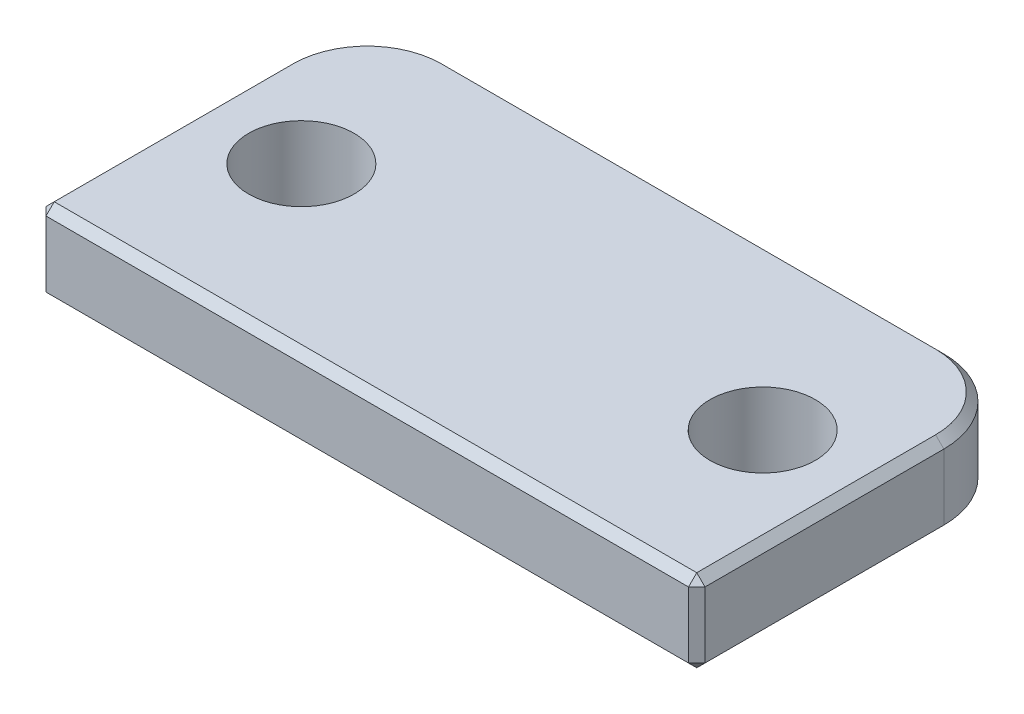
ISO-10303-21;
HEADER;
FILE_DESCRIPTION(('STEP AP214'),'2;1');
FILE_NAME('part.step','',(''),(''),'','','');
FILE_SCHEMA(('AUTOMOTIVE_DESIGN { 1 0 10303 214 1 1 1 1 }'));
ENDSEC;
DATA;
#1=APPLICATION_CONTEXT('core data for automotive mechanical design processes');
#2=APPLICATION_PROTOCOL_DEFINITION('international standard','automotive_design',2000,#1);
#3=PRODUCT_CONTEXT('',#1,'mechanical');
#4=PRODUCT('Part','Part','',(#3));
#5=PRODUCT_RELATED_PRODUCT_CATEGORY('part','',(#4));
#6=PRODUCT_DEFINITION_FORMATION('','',#4);
#7=PRODUCT_DEFINITION_CONTEXT('part definition',#1,'design');
#8=PRODUCT_DEFINITION('design','',#6,#7);
#9=PRODUCT_DEFINITION_SHAPE('','',#8);
#10=(LENGTH_UNIT() NAMED_UNIT(*) SI_UNIT(.MILLI.,.METRE.));
#11=(NAMED_UNIT(*) PLANE_ANGLE_UNIT() SI_UNIT($,.RADIAN.));
#12=(NAMED_UNIT(*) SI_UNIT($,.STERADIAN.) SOLID_ANGLE_UNIT());
#13=UNCERTAINTY_MEASURE_WITH_UNIT(LENGTH_MEASURE(1.E-05),#10,'distance_accuracy_value','');
#14=(GEOMETRIC_REPRESENTATION_CONTEXT(3) GLOBAL_UNCERTAINTY_ASSIGNED_CONTEXT((#13)) GLOBAL_UNIT_ASSIGNED_CONTEXT((#10,
#11,#12)) REPRESENTATION_CONTEXT('',''));
#15=CARTESIAN_POINT('',(0.,0.,0.));
#16=DIRECTION('',(0.,0.,1.));
#17=DIRECTION('',(1.,0.,0.));
#18=AXIS2_PLACEMENT_3D('',#15,#16,#17);
#19=CARTESIAN_POINT('',(20.,5.,10.));
#20=DIRECTION('',(-1.,0.,0.));
#21=DIRECTION('',(0.,0.,1.));
#22=AXIS2_PLACEMENT_3D('',#19,#20,#21);
#23=PLANE('',#22);
#24=DIRECTION('',(0.,-1.,0.));
#25=VECTOR('',#24,1.);
#26=CARTESIAN_POINT('',(20.,5.,9.5));
#27=LINE('',#26,#25);
#28=CARTESIAN_POINT('',(20.,4.5,9.5));
#29=VERTEX_POINT('',#28);
#30=CARTESIAN_POINT('',(20.,0.5,9.5));
#31=VERTEX_POINT('',#30);
#32=EDGE_CURVE('E53',#29,#31,#27,.T.);
#33=ORIENTED_EDGE('',*,*,#32,.T.);
#34=DIRECTION('',(0.,0.,-1.));
#35=VECTOR('',#34,1.);
#36=CARTESIAN_POINT('',(20.,0.5,-5.));
#37=LINE('',#36,#35);
#38=CARTESIAN_POINT('',(20.,0.5,-5.));
#39=VERTEX_POINT('',#38);
#40=EDGE_CURVE('E11',#31,#39,#37,.T.);
#41=ORIENTED_EDGE('',*,*,#40,.T.);
#42=DIRECTION('',(0.,-1.,0.));
#43=VECTOR('',#42,1.);
#44=CARTESIAN_POINT('',(20.,5.,-5.));
#45=LINE('',#44,#43);
#46=CARTESIAN_POINT('',(20.,4.5,-5.));
#47=VERTEX_POINT('',#46);
#48=EDGE_CURVE('E183',#39,#47,#45,.F.);
#49=ORIENTED_EDGE('',*,*,#48,.T.);
#50=DIRECTION('',(0.,0.,1.));
#51=VECTOR('',#50,1.);
#52=CARTESIAN_POINT('',(20.,4.5,10.));
#53=LINE('',#52,#51);
#54=EDGE_CURVE('E64',#47,#29,#53,.T.);
#55=ORIENTED_EDGE('',*,*,#54,.T.);
#56=EDGE_LOOP('',(#33,#41,#49,#55));
#57=FACE_BOUND('',#56,.T.);
#58=ADVANCED_FACE('F43',(#57),#23,.F.);
#59=CARTESIAN_POINT('',(-20.,5.,-10.));
#60=DIRECTION('',(0.,0.,1.));
#61=DIRECTION('',(1.,0.,0.));
#62=AXIS2_PLACEMENT_3D('',#59,#60,#61);
#63=PLANE('',#62);
#64=DIRECTION('',(0.,-1.,0.));
#65=VECTOR('',#64,1.);
#66=CARTESIAN_POINT('',(15.,5.,-10.));
#67=LINE('',#66,#65);
#68=CARTESIAN_POINT('',(15.,4.5,-10.));
#69=VERTEX_POINT('',#68);
#70=CARTESIAN_POINT('',(15.,0.5,-10.));
#71=VERTEX_POINT('',#70);
#72=EDGE_CURVE('E176',#69,#71,#67,.T.);
#73=ORIENTED_EDGE('',*,*,#72,.T.);
#74=DIRECTION('',(-1.,0.,0.));
#75=VECTOR('',#74,1.);
#76=CARTESIAN_POINT('',(-15.,0.5,-10.));
#77=LINE('',#76,#75);
#78=CARTESIAN_POINT('',(-15.,0.5,-10.));
#79=VERTEX_POINT('',#78);
#80=EDGE_CURVE('E150',#71,#79,#77,.T.);
#81=ORIENTED_EDGE('',*,*,#80,.T.);
#82=DIRECTION('',(0.,-1.,0.));
#83=VECTOR('',#82,1.);
#84=CARTESIAN_POINT('',(-15.,5.,-10.));
#85=LINE('',#84,#83);
#86=CARTESIAN_POINT('',(-15.,4.5,-10.));
#87=VERTEX_POINT('',#86);
#88=EDGE_CURVE('E173',#79,#87,#85,.F.);
#89=ORIENTED_EDGE('',*,*,#88,.T.);
#90=DIRECTION('',(1.,0.,0.));
#91=VECTOR('',#90,1.);
#92=CARTESIAN_POINT('',(-20.,4.5,-10.));
#93=LINE('',#92,#91);
#94=EDGE_CURVE('E179',#87,#69,#93,.T.);
#95=ORIENTED_EDGE('',*,*,#94,.T.);
#96=EDGE_LOOP('',(#73,#81,#89,#95));
#97=FACE_BOUND('',#96,.T.);
#98=ADVANCED_FACE('F172',(#97),#63,.F.);
#99=CARTESIAN_POINT('',(-20.,5.,10.));
#100=DIRECTION('',(1.,0.,0.));
#101=DIRECTION('',(0.,0.,-1.));
#102=AXIS2_PLACEMENT_3D('',#99,#100,#101);
#103=PLANE('',#102);
#104=DIRECTION('',(0.,1.,0.));
#105=VECTOR('',#104,1.);
#106=CARTESIAN_POINT('',(-20.,5.,9.5));
#107=LINE('',#106,#105);
#108=CARTESIAN_POINT('',(-20.,0.5,9.5));
#109=VERTEX_POINT('',#108);
#110=CARTESIAN_POINT('',(-20.,4.5,9.5));
#111=VERTEX_POINT('',#110);
#112=EDGE_CURVE('E229',#109,#111,#107,.T.);
#113=ORIENTED_EDGE('',*,*,#112,.T.);
#114=DIRECTION('',(0.,0.,-1.));
#115=VECTOR('',#114,1.);
#116=CARTESIAN_POINT('',(-20.,4.5,10.));
#117=LINE('',#116,#115);
#118=CARTESIAN_POINT('',(-20.,4.5,-5.));
#119=VERTEX_POINT('',#118);
#120=EDGE_CURVE('E231',#111,#119,#117,.T.);
#121=ORIENTED_EDGE('',*,*,#120,.T.);
#122=DIRECTION('',(0.,-1.,0.));
#123=VECTOR('',#122,1.);
#124=CARTESIAN_POINT('',(-20.,5.,-5.));
#125=LINE('',#124,#123);
#126=CARTESIAN_POINT('',(-20.,0.5,-5.));
#127=VERTEX_POINT('',#126);
#128=EDGE_CURVE('E186',#119,#127,#125,.T.);
#129=ORIENTED_EDGE('',*,*,#128,.T.);
#130=DIRECTION('',(0.,0.,1.));
#131=VECTOR('',#130,1.);
#132=CARTESIAN_POINT('',(-20.,0.5,10.));
#133=LINE('',#132,#131);
#134=EDGE_CURVE('E227',#127,#109,#133,.T.);
#135=ORIENTED_EDGE('',*,*,#134,.T.);
#136=EDGE_LOOP('',(#113,#121,#129,#135));
#137=FACE_BOUND('',#136,.T.);
#138=ADVANCED_FACE('F305',(#137),#103,.F.);
#139=CARTESIAN_POINT('',(-20.,5.,10.));
#140=DIRECTION('',(0.,0.,-1.));
#141=DIRECTION('',(-1.,0.,0.));
#142=AXIS2_PLACEMENT_3D('',#139,#140,#141);
#143=PLANE('',#142);
#144=DIRECTION('',(-1.,0.,0.));
#145=VECTOR('',#144,1.);
#146=CARTESIAN_POINT('',(-20.,4.5,10.));
#147=LINE('',#146,#145);
#148=CARTESIAN_POINT('',(19.5,4.5,10.));
#149=VERTEX_POINT('',#148);
#150=CARTESIAN_POINT('',(-19.5,4.5,10.));
#151=VERTEX_POINT('',#150);
#152=EDGE_CURVE('E218',#149,#151,#147,.T.);
#153=ORIENTED_EDGE('',*,*,#152,.T.);
#154=DIRECTION('',(0.,-1.,0.));
#155=VECTOR('',#154,1.);
#156=CARTESIAN_POINT('',(-19.5,5.,10.));
#157=LINE('',#156,#155);
#158=CARTESIAN_POINT('',(-19.5,0.5,10.));
#159=VERTEX_POINT('',#158);
#160=EDGE_CURVE('E224',#151,#159,#157,.T.);
#161=ORIENTED_EDGE('',*,*,#160,.T.);
#162=DIRECTION('',(1.,0.,0.));
#163=VECTOR('',#162,1.);
#164=CARTESIAN_POINT('',(20.,0.5,10.));
#165=LINE('',#164,#163);
#166=CARTESIAN_POINT('',(19.5,0.5,10.));
#167=VERTEX_POINT('',#166);
#168=EDGE_CURVE('E222',#159,#167,#165,.T.);
#169=ORIENTED_EDGE('',*,*,#168,.T.);
#170=DIRECTION('',(0.,1.,0.));
#171=VECTOR('',#170,1.);
#172=CARTESIAN_POINT('',(19.5,5.,10.));
#173=LINE('',#172,#171);
#174=EDGE_CURVE('E220',#167,#149,#173,.T.);
#175=ORIENTED_EDGE('',*,*,#174,.T.);
#176=EDGE_LOOP('',(#153,#161,#169,#175));
#177=FACE_BOUND('',#176,.T.);
#178=ADVANCED_FACE('F326',(#177),#143,.F.);
#179=CARTESIAN_POINT('',(0.,5.,0.));
#180=DIRECTION('',(0.,-1.,0.));
#181=DIRECTION('',(0.,0.,-1.));
#182=AXIS2_PLACEMENT_3D('',#179,#180,#181);
#183=PLANE('',#182);
#184=CARTESIAN_POINT('',(15.,5.,-5.));
#185=DIRECTION('',(0.,-1.,0.));
#186=DIRECTION('',(0.,0.,-1.));
#187=AXIS2_PLACEMENT_3D('',#184,#185,#186);
#188=CIRCLE('',#187,4.5);
#189=CARTESIAN_POINT('',(19.5,5.,-5.));
#190=VERTEX_POINT('',#189);
#191=CARTESIAN_POINT('',(15.,5.,-9.5));
#192=VERTEX_POINT('',#191);
#193=EDGE_CURVE('E207',#190,#192,#188,.F.);
#194=ORIENTED_EDGE('',*,*,#193,.T.);
#195=DIRECTION('',(-1.,0.,0.));
#196=VECTOR('',#195,1.);
#197=CARTESIAN_POINT('',(0.,5.,-9.5));
#198=LINE('',#197,#196);
#199=CARTESIAN_POINT('',(-15.,5.,-9.5));
#200=VERTEX_POINT('',#199);
#201=EDGE_CURVE('E167',#192,#200,#198,.T.);
#202=ORIENTED_EDGE('',*,*,#201,.T.);
#203=CARTESIAN_POINT('',(-15.,5.,-5.));
#204=DIRECTION('',(0.,-1.,0.));
#205=DIRECTION('',(0.,0.,-1.));
#206=AXIS2_PLACEMENT_3D('',#203,#204,#205);
#207=CIRCLE('',#206,4.5);
#208=CARTESIAN_POINT('',(-19.5,5.,-5.));
#209=VERTEX_POINT('',#208);
#210=EDGE_CURVE('E209',#200,#209,#207,.F.);
#211=ORIENTED_EDGE('',*,*,#210,.T.);
#212=DIRECTION('',(0.,0.,1.));
#213=VECTOR('',#212,1.);
#214=CARTESIAN_POINT('',(-19.5,5.,0.));
#215=LINE('',#214,#213);
#216=CARTESIAN_POINT('',(-19.5,5.,9.5));
#217=VERTEX_POINT('',#216);
#218=EDGE_CURVE('E205',#209,#217,#215,.T.);
#219=ORIENTED_EDGE('',*,*,#218,.T.);
#220=DIRECTION('',(1.,0.,0.));
#221=VECTOR('',#220,1.);
#222=CARTESIAN_POINT('',(0.,5.,9.5));
#223=LINE('',#222,#221);
#224=CARTESIAN_POINT('',(19.5,5.,9.5));
#225=VERTEX_POINT('',#224);
#226=EDGE_CURVE('E201',#217,#225,#223,.T.);
#227=ORIENTED_EDGE('',*,*,#226,.T.);
#228=DIRECTION('',(0.,0.,-1.));
#229=VECTOR('',#228,1.);
#230=CARTESIAN_POINT('',(19.5,5.,0.));
#231=LINE('',#230,#229);
#232=EDGE_CURVE('E203',#225,#190,#231,.T.);
#233=ORIENTED_EDGE('',*,*,#232,.T.);
#234=EDGE_LOOP('',(#194,#202,#211,#219,#227,#233));
#235=FACE_BOUND('',#234,.T.);
#236=CARTESIAN_POINT('',(-14.,5.,0.));
#237=DIRECTION('',(0.,1.,0.));
#238=DIRECTION('',(0.,0.,1.));
#239=AXIS2_PLACEMENT_3D('',#236,#237,#238);
#240=CIRCLE('',#239,3.2);
#241=CARTESIAN_POINT('',(-14.,5.,3.2));
#242=VERTEX_POINT('',#241);
#243=EDGE_CURVE('E285',#242,#242,#240,.T.);
#244=ORIENTED_EDGE('',*,*,#243,.F.);
#245=EDGE_LOOP('',(#244));
#246=FACE_BOUND('',#245,.T.);
#247=CARTESIAN_POINT('',(14.,5.,0.));
#248=DIRECTION('',(0.,1.,0.));
#249=DIRECTION('',(0.,0.,1.));
#250=AXIS2_PLACEMENT_3D('',#247,#248,#249);
#251=CIRCLE('',#250,3.2);
#252=CARTESIAN_POINT('',(14.,5.,3.2));
#253=VERTEX_POINT('',#252);
#254=EDGE_CURVE('E296',#253,#253,#251,.T.);
#255=ORIENTED_EDGE('',*,*,#254,.F.);
#256=EDGE_LOOP('',(#255));
#257=FACE_BOUND('',#256,.T.);
#258=ADVANCED_FACE('F345',(#235,#246,#257),#183,.F.);
#259=CARTESIAN_POINT('',(0.,0.,0.));
#260=DIRECTION('',(0.,-1.,0.));
#261=DIRECTION('',(0.,0.,-1.));
#262=AXIS2_PLACEMENT_3D('',#259,#260,#261);
#263=PLANE('',#262);
#264=CARTESIAN_POINT('',(-15.,0.,-5.));
#265=DIRECTION('',(0.,-1.,0.));
#266=DIRECTION('',(0.,0.,-1.));
#267=AXIS2_PLACEMENT_3D('',#264,#265,#266);
#268=CIRCLE('',#267,4.5);
#269=CARTESIAN_POINT('',(-19.5,0.,-5.));
#270=VERTEX_POINT('',#269);
#271=CARTESIAN_POINT('',(-15.,0.,-9.5));
#272=VERTEX_POINT('',#271);
#273=EDGE_CURVE('E198',#270,#272,#268,.T.);
#274=ORIENTED_EDGE('',*,*,#273,.T.);
#275=DIRECTION('',(1.,0.,0.));
#276=VECTOR('',#275,1.);
#277=CARTESIAN_POINT('',(15.,0.,-9.5));
#278=LINE('',#277,#276);
#279=CARTESIAN_POINT('',(15.,0.,-9.5));
#280=VERTEX_POINT('',#279);
#281=EDGE_CURVE('E152',#272,#280,#278,.T.);
#282=ORIENTED_EDGE('',*,*,#281,.T.);
#283=CARTESIAN_POINT('',(15.,0.,-5.));
#284=DIRECTION('',(0.,-1.,0.));
#285=DIRECTION('',(0.,0.,-1.));
#286=AXIS2_PLACEMENT_3D('',#283,#284,#285);
#287=CIRCLE('',#286,4.5);
#288=CARTESIAN_POINT('',(19.5,0.,-5.));
#289=VERTEX_POINT('',#288);
#290=EDGE_CURVE('E196',#280,#289,#287,.T.);
#291=ORIENTED_EDGE('',*,*,#290,.T.);
#292=DIRECTION('',(0.,0.,1.));
#293=VECTOR('',#292,1.);
#294=CARTESIAN_POINT('',(19.5,0.,10.));
#295=LINE('',#294,#293);
#296=CARTESIAN_POINT('',(19.5,0.,9.5));
#297=VERTEX_POINT('',#296);
#298=EDGE_CURVE('E192',#289,#297,#295,.T.);
#299=ORIENTED_EDGE('',*,*,#298,.T.);
#300=DIRECTION('',(-1.,0.,0.));
#301=VECTOR('',#300,1.);
#302=CARTESIAN_POINT('',(-20.,0.,9.5));
#303=LINE('',#302,#301);
#304=CARTESIAN_POINT('',(-19.5,0.,9.5));
#305=VERTEX_POINT('',#304);
#306=EDGE_CURVE('E178',#297,#305,#303,.T.);
#307=ORIENTED_EDGE('',*,*,#306,.T.);
#308=DIRECTION('',(0.,0.,-1.));
#309=VECTOR('',#308,1.);
#310=CARTESIAN_POINT('',(-19.5,0.,-5.));
#311=LINE('',#310,#309);
#312=EDGE_CURVE('E194',#305,#270,#311,.T.);
#313=ORIENTED_EDGE('',*,*,#312,.T.);
#314=EDGE_LOOP('',(#274,#282,#291,#299,#307,#313));
#315=FACE_BOUND('',#314,.T.);
#316=CARTESIAN_POINT('',(-14.,0.,0.));
#317=DIRECTION('',(0.,1.,0.));
#318=DIRECTION('',(0.,0.,1.));
#319=AXIS2_PLACEMENT_3D('',#316,#317,#318);
#320=CIRCLE('',#319,3.2);
#321=CARTESIAN_POINT('',(-14.,0.,3.2));
#322=VERTEX_POINT('',#321);
#323=EDGE_CURVE('E291',#322,#322,#320,.T.);
#324=ORIENTED_EDGE('',*,*,#323,.T.);
#325=EDGE_LOOP('',(#324));
#326=FACE_BOUND('',#325,.T.);
#327=CARTESIAN_POINT('',(14.,0.,0.));
#328=DIRECTION('',(0.,1.,0.));
#329=DIRECTION('',(0.,0.,1.));
#330=AXIS2_PLACEMENT_3D('',#327,#328,#329);
#331=CIRCLE('',#330,3.2);
#332=CARTESIAN_POINT('',(14.,0.,3.2));
#333=VERTEX_POINT('',#332);
#334=EDGE_CURVE('E301',#333,#333,#331,.T.);
#335=ORIENTED_EDGE('',*,*,#334,.T.);
#336=EDGE_LOOP('',(#335));
#337=FACE_BOUND('',#336,.T.);
#338=ADVANCED_FACE('F373',(#315,#326,#337),#263,.T.);
#339=CARTESIAN_POINT('',(14.,5.,0.));
#340=DIRECTION('',(0.,1.,0.));
#341=DIRECTION('',(0.,0.,1.));
#342=AXIS2_PLACEMENT_3D('',#339,#340,#341);
#343=CYLINDRICAL_SURFACE('',#342,3.2);
#344=ORIENTED_EDGE('',*,*,#334,.F.);
#345=EDGE_LOOP('',(#344));
#346=FACE_BOUND('',#345,.T.);
#347=ORIENTED_EDGE('',*,*,#254,.T.);
#348=EDGE_LOOP('',(#347));
#349=FACE_BOUND('',#348,.T.);
#350=ADVANCED_FACE('F376',(#346,#349),#343,.F.);
#351=CARTESIAN_POINT('',(-14.,5.,0.));
#352=DIRECTION('',(0.,1.,0.));
#353=DIRECTION('',(0.,0.,1.));
#354=AXIS2_PLACEMENT_3D('',#351,#352,#353);
#355=CYLINDRICAL_SURFACE('',#354,3.2);
#356=ORIENTED_EDGE('',*,*,#323,.F.);
#357=EDGE_LOOP('',(#356));
#358=FACE_BOUND('',#357,.T.);
#359=ORIENTED_EDGE('',*,*,#243,.T.);
#360=EDGE_LOOP('',(#359));
#361=FACE_BOUND('',#360,.T.);
#362=ADVANCED_FACE('F384',(#358,#361),#355,.F.);
#363=CARTESIAN_POINT('',(-15.,5.,-5.));
#364=DIRECTION('',(0.,-1.,0.));
#365=DIRECTION('',(0.,0.,-1.));
#366=AXIS2_PLACEMENT_3D('',#363,#364,#365);
#367=CYLINDRICAL_SURFACE('',#366,5.);
#368=ORIENTED_EDGE('',*,*,#128,.F.);
#369=CARTESIAN_POINT('',(-15.,4.5,-5.));
#370=DIRECTION('',(0.,-1.,0.));
#371=DIRECTION('',(0.,0.,-1.));
#372=AXIS2_PLACEMENT_3D('',#369,#370,#371);
#373=CIRCLE('',#372,5.);
#374=EDGE_CURVE('E166',#119,#87,#373,.T.);
#375=ORIENTED_EDGE('',*,*,#374,.T.);
#376=ORIENTED_EDGE('',*,*,#88,.F.);
#377=CARTESIAN_POINT('',(-15.,0.5,-5.));
#378=DIRECTION('',(0.,-1.,0.));
#379=DIRECTION('',(0.,0.,-1.));
#380=AXIS2_PLACEMENT_3D('',#377,#378,#379);
#381=CIRCLE('',#380,5.);
#382=EDGE_CURVE('E158',#79,#127,#381,.F.);
#383=ORIENTED_EDGE('',*,*,#382,.T.);
#384=EDGE_LOOP('',(#368,#375,#376,#383));
#385=FACE_BOUND('',#384,.T.);
#386=ADVANCED_FACE('F181',(#385),#367,.T.);
#387=CARTESIAN_POINT('',(15.,5.,-5.));
#388=DIRECTION('',(0.,-1.,0.));
#389=DIRECTION('',(0.,0.,-1.));
#390=AXIS2_PLACEMENT_3D('',#387,#388,#389);
#391=CYLINDRICAL_SURFACE('',#390,5.);
#392=ORIENTED_EDGE('',*,*,#48,.F.);
#393=CARTESIAN_POINT('',(15.,0.5,-5.));
#394=DIRECTION('',(0.,-1.,0.));
#395=DIRECTION('',(0.,0.,-1.));
#396=AXIS2_PLACEMENT_3D('',#393,#394,#395);
#397=CIRCLE('',#396,5.);
#398=EDGE_CURVE('E216',#39,#71,#397,.F.);
#399=ORIENTED_EDGE('',*,*,#398,.T.);
#400=ORIENTED_EDGE('',*,*,#72,.F.);
#401=CARTESIAN_POINT('',(15.,4.5,-5.));
#402=DIRECTION('',(0.,-1.,0.));
#403=DIRECTION('',(0.,0.,-1.));
#404=AXIS2_PLACEMENT_3D('',#401,#402,#403);
#405=CIRCLE('',#404,5.);
#406=EDGE_CURVE('E214',#69,#47,#405,.T.);
#407=ORIENTED_EDGE('',*,*,#406,.T.);
#408=EDGE_LOOP('',(#392,#399,#400,#407));
#409=FACE_BOUND('',#408,.T.);
#410=ADVANCED_FACE('F368',(#409),#391,.T.);
#411=CARTESIAN_POINT('',(0.,5.,-9.5));
#412=DIRECTION('',(0.,-0.707106781186547,0.707106781186547));
#413=DIRECTION('',(-1.,0.,0.));
#414=AXIS2_PLACEMENT_3D('',#411,#412,#413);
#415=PLANE('',#414);
#416=DIRECTION('',(0.,-0.707106781186547,-0.707106781186547));
#417=VECTOR('',#416,1.);
#418=CARTESIAN_POINT('',(-15.,5.,-9.5));
#419=LINE('',#418,#417);
#420=EDGE_CURVE('E280',#200,#87,#419,.T.);
#421=ORIENTED_EDGE('',*,*,#420,.F.);
#422=ORIENTED_EDGE('',*,*,#201,.F.);
#423=DIRECTION('',(0.,0.707106781186547,0.707106781186547));
#424=VECTOR('',#423,1.);
#425=CARTESIAN_POINT('',(15.,4.5,-10.));
#426=LINE('',#425,#424);
#427=EDGE_CURVE('E48',#69,#192,#426,.T.);
#428=ORIENTED_EDGE('',*,*,#427,.F.);
#429=ORIENTED_EDGE('',*,*,#94,.F.);
#430=EDGE_LOOP('',(#421,#422,#428,#429));
#431=FACE_BOUND('',#430,.T.);
#432=ADVANCED_FACE('F46',(#431),#415,.F.);
#433=CARTESIAN_POINT('',(15.,5.,-5.));
#434=DIRECTION('',(0.,-1.,0.));
#435=DIRECTION('',(0.,0.,-1.));
#436=AXIS2_PLACEMENT_3D('',#433,#434,#435);
#437=CONICAL_SURFACE('',#436,4.5,0.785398163397448);
#438=ORIENTED_EDGE('',*,*,#427,.T.);
#439=ORIENTED_EDGE('',*,*,#193,.F.);
#440=DIRECTION('',(-0.707106781186547,0.707106781186547,0.));
#441=VECTOR('',#440,1.);
#442=CARTESIAN_POINT('',(20.,4.5,-5.));
#443=LINE('',#442,#441);
#444=EDGE_CURVE('E278',#47,#190,#443,.T.);
#445=ORIENTED_EDGE('',*,*,#444,.F.);
#446=ORIENTED_EDGE('',*,*,#406,.F.);
#447=EDGE_LOOP('',(#438,#439,#445,#446));
#448=FACE_BOUND('',#447,.T.);
#449=ADVANCED_FACE('F349',(#448),#437,.T.);
#450=CARTESIAN_POINT('',(-15.,5.,-5.));
#451=DIRECTION('',(0.,-1.,0.));
#452=DIRECTION('',(0.,0.,-1.));
#453=AXIS2_PLACEMENT_3D('',#450,#451,#452);
#454=CONICAL_SURFACE('',#453,4.5,0.785398163397447);
#455=ORIENTED_EDGE('',*,*,#420,.T.);
#456=ORIENTED_EDGE('',*,*,#374,.F.);
#457=DIRECTION('',(-0.707106781186547,-0.707106781186547,0.));
#458=VECTOR('',#457,1.);
#459=CARTESIAN_POINT('',(-19.5,5.,-5.));
#460=LINE('',#459,#458);
#461=EDGE_CURVE('E275',#209,#119,#460,.T.);
#462=ORIENTED_EDGE('',*,*,#461,.F.);
#463=ORIENTED_EDGE('',*,*,#210,.F.);
#464=EDGE_LOOP('',(#455,#456,#462,#463));
#465=FACE_BOUND('',#464,.T.);
#466=ADVANCED_FACE('F341',(#465),#454,.T.);
#467=CARTESIAN_POINT('',(19.5,5.,0.));
#468=DIRECTION('',(-0.707106781186547,-0.707106781186547,0.));
#469=DIRECTION('',(0.,0.,-1.));
#470=AXIS2_PLACEMENT_3D('',#467,#468,#469);
#471=PLANE('',#470);
#472=ORIENTED_EDGE('',*,*,#444,.T.);
#473=ORIENTED_EDGE('',*,*,#232,.F.);
#474=DIRECTION('',(0.707106781186547,-0.707106781186547,0.));
#475=VECTOR('',#474,1.);
#476=CARTESIAN_POINT('',(19.75,4.75,9.5));
#477=LINE('',#476,#475);
#478=EDGE_CURVE('E269',#29,#225,#477,.F.);
#479=ORIENTED_EDGE('',*,*,#478,.F.);
#480=ORIENTED_EDGE('',*,*,#54,.F.);
#481=EDGE_LOOP('',(#472,#473,#479,#480));
#482=FACE_BOUND('',#481,.T.);
#483=ADVANCED_FACE('F351',(#482),#471,.F.);
#484=CARTESIAN_POINT('',(-19.5,5.,0.));
#485=DIRECTION('',(0.707106781186547,-0.707106781186547,0.));
#486=DIRECTION('',(0.,0.,1.));
#487=AXIS2_PLACEMENT_3D('',#484,#485,#486);
#488=PLANE('',#487);
#489=ORIENTED_EDGE('',*,*,#461,.T.);
#490=ORIENTED_EDGE('',*,*,#120,.F.);
#491=DIRECTION('',(0.707106781186547,0.707106781186547,0.));
#492=VECTOR('',#491,1.);
#493=CARTESIAN_POINT('',(-20.,4.5,9.5));
#494=LINE('',#493,#492);
#495=EDGE_CURVE('E266',#217,#111,#494,.F.);
#496=ORIENTED_EDGE('',*,*,#495,.F.);
#497=ORIENTED_EDGE('',*,*,#218,.F.);
#498=EDGE_LOOP('',(#489,#490,#496,#497));
#499=FACE_BOUND('',#498,.T.);
#500=ADVANCED_FACE('F339',(#499),#488,.F.);
#501=CARTESIAN_POINT('',(0.,5.,9.5));
#502=DIRECTION('',(0.,-0.707106781186547,-0.707106781186547));
#503=DIRECTION('',(1.,0.,0.));
#504=AXIS2_PLACEMENT_3D('',#501,#502,#503);
#505=PLANE('',#504);
#506=DIRECTION('',(0.,0.707106781186547,-0.707106781186547));
#507=VECTOR('',#506,1.);
#508=CARTESIAN_POINT('',(19.5,4.5,10.));
#509=LINE('',#508,#507);
#510=EDGE_CURVE('E272',#225,#149,#509,.F.);
#511=ORIENTED_EDGE('',*,*,#510,.F.);
#512=ORIENTED_EDGE('',*,*,#226,.F.);
#513=DIRECTION('',(0.,-0.707106781186547,0.707106781186547));
#514=VECTOR('',#513,1.);
#515=CARTESIAN_POINT('',(-19.5,4.75,9.75));
#516=LINE('',#515,#514);
#517=EDGE_CURVE('E263',#151,#217,#516,.F.);
#518=ORIENTED_EDGE('',*,*,#517,.F.);
#519=ORIENTED_EDGE('',*,*,#152,.F.);
#520=EDGE_LOOP('',(#511,#512,#518,#519));
#521=FACE_BOUND('',#520,.T.);
#522=ADVANCED_FACE('F333',(#521),#505,.F.);
#523=CARTESIAN_POINT('',(19.5,4.5,10.));
#524=DIRECTION('',(0.577350269189626,0.577350269189626,0.577350269189626));
#525=DIRECTION('',(0.707106781186547,0.,-0.707106781186547));
#526=AXIS2_PLACEMENT_3D('',#523,#524,#525);
#527=PLANE('',#526);
#528=ORIENTED_EDGE('',*,*,#478,.T.);
#529=ORIENTED_EDGE('',*,*,#510,.T.);
#530=DIRECTION('',(-0.707106781186547,0.,0.707106781186547));
#531=VECTOR('',#530,1.);
#532=CARTESIAN_POINT('',(19.5,4.5,10.));
#533=LINE('',#532,#531);
#534=EDGE_CURVE('E260',#29,#149,#533,.T.);
#535=ORIENTED_EDGE('',*,*,#534,.F.);
#536=EDGE_LOOP('',(#528,#529,#535));
#537=FACE_BOUND('',#536,.T.);
#538=ADVANCED_FACE('F354',(#537),#527,.T.);
#539=CARTESIAN_POINT('',(-20.,4.5,9.5));
#540=DIRECTION('',(-0.577350269189626,0.577350269189626,0.577350269189626));
#541=DIRECTION('',(0.707106781186547,0.,0.707106781186547));
#542=AXIS2_PLACEMENT_3D('',#539,#540,#541);
#543=PLANE('',#542);
#544=ORIENTED_EDGE('',*,*,#517,.T.);
#545=ORIENTED_EDGE('',*,*,#495,.T.);
#546=DIRECTION('',(-0.707106781186547,0.,-0.707106781186547));
#547=VECTOR('',#546,1.);
#548=CARTESIAN_POINT('',(-20.,4.5,9.5));
#549=LINE('',#548,#547);
#550=EDGE_CURVE('E257',#151,#111,#549,.T.);
#551=ORIENTED_EDGE('',*,*,#550,.F.);
#552=EDGE_LOOP('',(#544,#545,#551));
#553=FACE_BOUND('',#552,.T.);
#554=ADVANCED_FACE('F336',(#553),#543,.T.);
#555=CARTESIAN_POINT('',(20.,5.,9.5));
#556=DIRECTION('',(-0.707106781186547,0.,-0.707106781186547));
#557=DIRECTION('',(0.,-1.,0.));
#558=AXIS2_PLACEMENT_3D('',#555,#556,#557);
#559=PLANE('',#558);
#560=ORIENTED_EDGE('',*,*,#534,.T.);
#561=ORIENTED_EDGE('',*,*,#174,.F.);
#562=DIRECTION('',(0.707106781186547,0.,-0.707106781186547));
#563=VECTOR('',#562,1.);
#564=CARTESIAN_POINT('',(19.75,0.5,9.75));
#565=LINE('',#564,#563);
#566=EDGE_CURVE('E251',#31,#167,#565,.F.);
#567=ORIENTED_EDGE('',*,*,#566,.F.);
#568=ORIENTED_EDGE('',*,*,#32,.F.);
#569=EDGE_LOOP('',(#560,#561,#567,#568));
#570=FACE_BOUND('',#569,.T.);
#571=ADVANCED_FACE('F356',(#570),#559,.F.);
#572=CARTESIAN_POINT('',(-19.5,5.,10.));
#573=DIRECTION('',(0.707106781186547,0.,-0.707106781186547));
#574=DIRECTION('',(0.,-1.,0.));
#575=AXIS2_PLACEMENT_3D('',#572,#573,#574);
#576=PLANE('',#575);
#577=ORIENTED_EDGE('',*,*,#550,.T.);
#578=ORIENTED_EDGE('',*,*,#112,.F.);
#579=DIRECTION('',(0.707106781186547,0.,0.707106781186547));
#580=VECTOR('',#579,1.);
#581=CARTESIAN_POINT('',(-19.5,0.5,10.));
#582=LINE('',#581,#580);
#583=EDGE_CURVE('E248',#159,#109,#582,.F.);
#584=ORIENTED_EDGE('',*,*,#583,.F.);
#585=ORIENTED_EDGE('',*,*,#160,.F.);
#586=EDGE_LOOP('',(#577,#578,#584,#585));
#587=FACE_BOUND('',#586,.T.);
#588=ADVANCED_FACE('F319',(#587),#576,.F.);
#589=CARTESIAN_POINT('',(-20.,0.5,10.));
#590=DIRECTION('',(0.,-0.707106781186547,0.707106781186547));
#591=DIRECTION('',(-1.,0.,0.));
#592=AXIS2_PLACEMENT_3D('',#589,#590,#591);
#593=PLANE('',#592);
#594=DIRECTION('',(0.,-0.707106781186547,-0.707106781186547));
#595=VECTOR('',#594,1.);
#596=CARTESIAN_POINT('',(19.5,0.,9.5));
#597=LINE('',#596,#595);
#598=EDGE_CURVE('E254',#167,#297,#597,.T.);
#599=ORIENTED_EDGE('',*,*,#598,.F.);
#600=ORIENTED_EDGE('',*,*,#168,.F.);
#601=DIRECTION('',(0.,0.707106781186547,0.707106781186547));
#602=VECTOR('',#601,1.);
#603=CARTESIAN_POINT('',(-19.5,0.5,10.));
#604=LINE('',#603,#602);
#605=EDGE_CURVE('E246',#305,#159,#604,.T.);
#606=ORIENTED_EDGE('',*,*,#605,.F.);
#607=ORIENTED_EDGE('',*,*,#306,.F.);
#608=EDGE_LOOP('',(#599,#600,#606,#607));
#609=FACE_BOUND('',#608,.T.);
#610=ADVANCED_FACE('F322',(#609),#593,.T.);
#611=CARTESIAN_POINT('',(19.5,0.,9.5));
#612=DIRECTION('',(0.577350269189626,-0.577350269189626,0.577350269189626));
#613=DIRECTION('',(0.707106781186547,0.,-0.707106781186547));
#614=AXIS2_PLACEMENT_3D('',#611,#612,#613);
#615=PLANE('',#614);
#616=ORIENTED_EDGE('',*,*,#566,.T.);
#617=ORIENTED_EDGE('',*,*,#598,.T.);
#618=DIRECTION('',(0.707106781186547,0.707106781186547,0.));
#619=VECTOR('',#618,1.);
#620=CARTESIAN_POINT('',(19.5,0.,9.5));
#621=LINE('',#620,#619);
#622=EDGE_CURVE('E243',#31,#297,#621,.F.);
#623=ORIENTED_EDGE('',*,*,#622,.F.);
#624=EDGE_LOOP('',(#616,#617,#623));
#625=FACE_BOUND('',#624,.T.);
#626=ADVANCED_FACE('F360',(#625),#615,.T.);
#627=CARTESIAN_POINT('',(-19.5,0.5,10.));
#628=DIRECTION('',(-0.577350269189626,-0.577350269189626,0.577350269189626));
#629=DIRECTION('',(0.707106781186547,0.,0.707106781186547));
#630=AXIS2_PLACEMENT_3D('',#627,#628,#629);
#631=PLANE('',#630);
#632=ORIENTED_EDGE('',*,*,#605,.T.);
#633=ORIENTED_EDGE('',*,*,#583,.T.);
#634=DIRECTION('',(0.707106781186547,-0.707106781186547,0.));
#635=VECTOR('',#634,1.);
#636=CARTESIAN_POINT('',(-19.75,0.25,9.5));
#637=LINE('',#636,#635);
#638=EDGE_CURVE('E240',#305,#109,#637,.F.);
#639=ORIENTED_EDGE('',*,*,#638,.F.);
#640=EDGE_LOOP('',(#632,#633,#639));
#641=FACE_BOUND('',#640,.T.);
#642=ADVANCED_FACE('F313',(#641),#631,.T.);
#643=CARTESIAN_POINT('',(20.,0.5,10.));
#644=DIRECTION('',(0.707106781186547,-0.707106781186547,0.));
#645=DIRECTION('',(0.,0.,1.));
#646=AXIS2_PLACEMENT_3D('',#643,#644,#645);
#647=PLANE('',#646);
#648=ORIENTED_EDGE('',*,*,#622,.T.);
#649=ORIENTED_EDGE('',*,*,#298,.F.);
#650=DIRECTION('',(-0.707106781186547,-0.707106781186547,0.));
#651=VECTOR('',#650,1.);
#652=CARTESIAN_POINT('',(20.,0.5,-5.));
#653=LINE('',#652,#651);
#654=EDGE_CURVE('E237',#39,#289,#653,.T.);
#655=ORIENTED_EDGE('',*,*,#654,.F.);
#656=ORIENTED_EDGE('',*,*,#40,.F.);
#657=EDGE_LOOP('',(#648,#649,#655,#656));
#658=FACE_BOUND('',#657,.T.);
#659=ADVANCED_FACE('F364',(#658),#647,.T.);
#660=CARTESIAN_POINT('',(-20.,0.5,10.));
#661=DIRECTION('',(-0.707106781186547,-0.707106781186547,0.));
#662=DIRECTION('',(0.,0.,-1.));
#663=AXIS2_PLACEMENT_3D('',#660,#661,#662);
#664=PLANE('',#663);
#665=ORIENTED_EDGE('',*,*,#638,.T.);
#666=ORIENTED_EDGE('',*,*,#134,.F.);
#667=DIRECTION('',(-0.707106781186547,0.707106781186547,0.));
#668=VECTOR('',#667,1.);
#669=CARTESIAN_POINT('',(-19.5,0.,-5.));
#670=LINE('',#669,#668);
#671=EDGE_CURVE('E161',#270,#127,#670,.T.);
#672=ORIENTED_EDGE('',*,*,#671,.F.);
#673=ORIENTED_EDGE('',*,*,#312,.F.);
#674=EDGE_LOOP('',(#665,#666,#672,#673));
#675=FACE_BOUND('',#674,.T.);
#676=ADVANCED_FACE('F309',(#675),#664,.T.);
#677=CARTESIAN_POINT('',(15.,0.,-5.));
#678=DIRECTION('',(0.,1.,0.));
#679=DIRECTION('',(0.,0.,1.));
#680=AXIS2_PLACEMENT_3D('',#677,#678,#679);
#681=CONICAL_SURFACE('',#680,4.5,0.785398163397448);
#682=ORIENTED_EDGE('',*,*,#654,.T.);
#683=ORIENTED_EDGE('',*,*,#290,.F.);
#684=DIRECTION('',(0.,-0.707106781186547,0.707106781186547));
#685=VECTOR('',#684,1.);
#686=CARTESIAN_POINT('',(15.,0.5,-10.));
#687=LINE('',#686,#685);
#688=EDGE_CURVE('E155',#71,#280,#687,.T.);
#689=ORIENTED_EDGE('',*,*,#688,.F.);
#690=ORIENTED_EDGE('',*,*,#398,.F.);
#691=EDGE_LOOP('',(#682,#683,#689,#690));
#692=FACE_BOUND('',#691,.T.);
#693=ADVANCED_FACE('F370',(#692),#681,.T.);
#694=CARTESIAN_POINT('',(-15.,0.,-5.));
#695=DIRECTION('',(0.,1.,0.));
#696=DIRECTION('',(0.,0.,1.));
#697=AXIS2_PLACEMENT_3D('',#694,#695,#696);
#698=CONICAL_SURFACE('',#697,4.5,0.785398163397447);
#699=ORIENTED_EDGE('',*,*,#671,.T.);
#700=ORIENTED_EDGE('',*,*,#382,.F.);
#701=DIRECTION('',(0.,0.707106781186547,-0.707106781186547));
#702=VECTOR('',#701,1.);
#703=CARTESIAN_POINT('',(-15.,0.,-9.5));
#704=LINE('',#703,#702);
#705=EDGE_CURVE('E146',#272,#79,#704,.T.);
#706=ORIENTED_EDGE('',*,*,#705,.F.);
#707=ORIENTED_EDGE('',*,*,#273,.F.);
#708=EDGE_LOOP('',(#699,#700,#706,#707));
#709=FACE_BOUND('',#708,.T.);
#710=ADVANCED_FACE('F159',(#709),#698,.T.);
#711=CARTESIAN_POINT('',(-20.,0.5,-10.));
#712=DIRECTION('',(0.,-0.707106781186547,-0.707106781186547));
#713=DIRECTION('',(1.,0.,0.));
#714=AXIS2_PLACEMENT_3D('',#711,#712,#713);
#715=PLANE('',#714);
#716=ORIENTED_EDGE('',*,*,#688,.T.);
#717=ORIENTED_EDGE('',*,*,#281,.F.);
#718=ORIENTED_EDGE('',*,*,#705,.T.);
#719=ORIENTED_EDGE('',*,*,#80,.F.);
#720=EDGE_LOOP('',(#716,#717,#718,#719));
#721=FACE_BOUND('',#720,.T.);
#722=ADVANCED_FACE('F148',(#721),#715,.T.);
#723=CLOSED_SHELL('',(#58,#98,#138,#178,#258,#338,#350,#362,#386,#410,#432,#449,#466,#483,#500,
#522,#538,#554,#571,#588,#610,#626,#642,#659,#676,#693,#710,#722));
#724=MANIFOLD_SOLID_BREP('B2',#723);
#725=ADVANCED_BREP_SHAPE_REPRESENTATION('',(#18,#724),#14);
#726=SHAPE_DEFINITION_REPRESENTATION(#9,#725);
ENDSEC;
END-ISO-10303-21;
